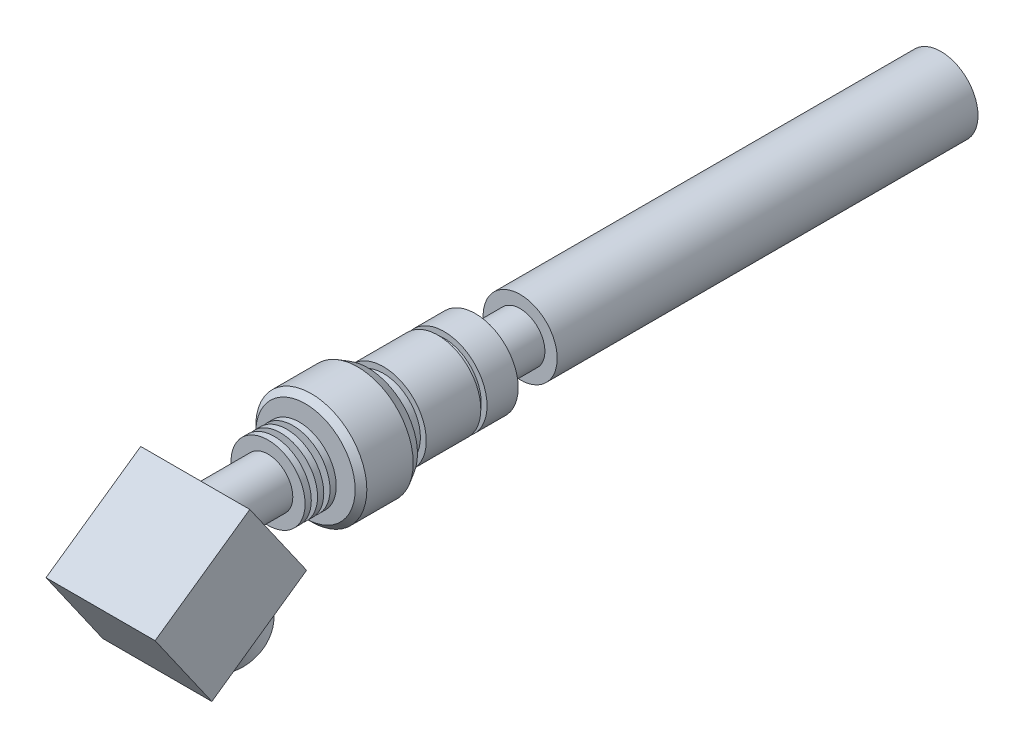
ISO-10303-21;
HEADER;
FILE_DESCRIPTION(('STEP AP214'),'2;1');
FILE_NAME('part.step','',(''),(''),'','','');
FILE_SCHEMA(('AUTOMOTIVE_DESIGN { 1 0 10303 214 1 1 1 1 }'));
ENDSEC;
DATA;
#1=APPLICATION_CONTEXT('core data for automotive mechanical design processes');
#2=APPLICATION_PROTOCOL_DEFINITION('international standard','automotive_design',2000,#1);
#3=PRODUCT_CONTEXT('',#1,'mechanical');
#4=PRODUCT('Part','Part','',(#3));
#5=PRODUCT_RELATED_PRODUCT_CATEGORY('part','',(#4));
#6=PRODUCT_DEFINITION_FORMATION('','',#4);
#7=PRODUCT_DEFINITION_CONTEXT('part definition',#1,'design');
#8=PRODUCT_DEFINITION('design','',#6,#7);
#9=PRODUCT_DEFINITION_SHAPE('','',#8);
#10=(LENGTH_UNIT() NAMED_UNIT(*) SI_UNIT(.MILLI.,.METRE.));
#11=(NAMED_UNIT(*) PLANE_ANGLE_UNIT() SI_UNIT($,.RADIAN.));
#12=(NAMED_UNIT(*) SI_UNIT($,.STERADIAN.) SOLID_ANGLE_UNIT());
#13=UNCERTAINTY_MEASURE_WITH_UNIT(LENGTH_MEASURE(1.E-05),#10,'distance_accuracy_value','');
#14=(GEOMETRIC_REPRESENTATION_CONTEXT(3) GLOBAL_UNCERTAINTY_ASSIGNED_CONTEXT((#13)) GLOBAL_UNIT_ASSIGNED_CONTEXT((#10,
#11,#12)) REPRESENTATION_CONTEXT('',''));
#15=CARTESIAN_POINT('',(0.,0.,0.));
#16=DIRECTION('',(0.,0.,1.));
#17=DIRECTION('',(1.,0.,0.));
#18=AXIS2_PLACEMENT_3D('',#15,#16,#17);
#19=CARTESIAN_POINT('',(-14.,-27.420874769388,201.119293340639));
#20=DIRECTION('',(0.,-0.819152044288995,-0.573576436351042));
#21=DIRECTION('',(0.,0.573576436351042,-0.819152044288995));
#22=AXIS2_PLACEMENT_3D('',#19,#20,#21);
#23=PLANE('',#22);
#24=DIRECTION('',(1.,0.,0.));
#25=VECTOR('',#24,1.);
#26=CARTESIAN_POINT('',(-14.,-10.4032309624702,176.815579258342));
#27=LINE('',#26,#25);
#28=CARTESIAN_POINT('',(-14.,-10.4032309624702,176.815579258342));
#29=VERTEX_POINT('',#28);
#30=CARTESIAN_POINT('',(14.,-10.4032309624702,176.815579258342));
#31=VERTEX_POINT('',#30);
#32=EDGE_CURVE('E75',#29,#31,#27,.T.);
#33=ORIENTED_EDGE('',*,*,#32,.T.);
#34=DIRECTION('',(0.,0.573576436351042,-0.819152044288995));
#35=VECTOR('',#34,1.);
#36=CARTESIAN_POINT('',(14.,-27.420874769388,201.119293340639));
#37=LINE('',#36,#35);
#38=CARTESIAN_POINT('',(14.,-27.420874769388,201.119293340639));
#39=VERTEX_POINT('',#38);
#40=EDGE_CURVE('E79',#39,#31,#37,.T.);
#41=ORIENTED_EDGE('',*,*,#40,.F.);
#42=DIRECTION('',(1.,0.,0.));
#43=VECTOR('',#42,1.);
#44=CARTESIAN_POINT('',(-14.,-27.420874769388,201.119293340639));
#45=LINE('',#44,#43);
#46=CARTESIAN_POINT('',(-14.,-27.420874769388,201.119293340639));
#47=VERTEX_POINT('',#46);
#48=EDGE_CURVE('E50',#47,#39,#45,.T.);
#49=ORIENTED_EDGE('',*,*,#48,.F.);
#50=DIRECTION('',(0.,0.573576436351042,-0.819152044288995));
#51=VECTOR('',#50,1.);
#52=CARTESIAN_POINT('',(-14.,-27.420874769388,201.119293340639));
#53=LINE('',#52,#51);
#54=EDGE_CURVE('E80',#47,#29,#53,.T.);
#55=ORIENTED_EDGE('',*,*,#54,.T.);
#56=EDGE_LOOP('',(#33,#41,#49,#55));
#57=FACE_BOUND('',#56,.T.);
#58=CARTESIAN_POINT('',(0.,-18.9120528659291,188.967436299491));
#59=DIRECTION('',(0.,-0.819152044288995,-0.573576436351042));
#60=DIRECTION('',(0.,0.573576436351042,-0.819152044288995));
#61=AXIS2_PLACEMENT_3D('',#58,#59,#60);
#62=CIRCLE('',#61,8.);
#63=CARTESIAN_POINT('',(0.,-14.3234413751208,182.414219945179));
#64=VERTEX_POINT('',#63);
#65=EDGE_CURVE('E102',#64,#64,#62,.T.);
#66=ORIENTED_EDGE('',*,*,#65,.F.);
#67=EDGE_LOOP('',(#66));
#68=FACE_BOUND('',#67,.T.);
#69=ADVANCED_FACE('F35',(#57,#68),#23,.T.);
#70=CARTESIAN_POINT('',(0.,0.,163.1));
#71=DIRECTION('',(0.,0.,1.));
#72=DIRECTION('',(1.,0.,0.));
#73=AXIS2_PLACEMENT_3D('',#70,#71,#72);
#74=PLANE('',#73);
#75=CARTESIAN_POINT('',(0.,0.,163.1));
#76=DIRECTION('',(0.,0.,1.));
#77=DIRECTION('',(1.,0.,0.));
#78=AXIS2_PLACEMENT_3D('',#75,#76,#77);
#79=CIRCLE('',#78,12.75);
#80=CARTESIAN_POINT('',(12.75,0.,163.1));
#81=VERTEX_POINT('',#80);
#82=EDGE_CURVE('E193',#81,#81,#79,.T.);
#83=ORIENTED_EDGE('',*,*,#82,.T.);
#84=EDGE_LOOP('',(#83));
#85=FACE_BOUND('',#84,.T.);
#86=CARTESIAN_POINT('',(0.,0.,163.1));
#87=DIRECTION('',(0.,0.,1.));
#88=DIRECTION('',(1.,0.,0.));
#89=AXIS2_PLACEMENT_3D('',#86,#87,#88);
#90=CIRCLE('',#89,6.35);
#91=CARTESIAN_POINT('',(6.35,0.,163.1));
#92=VERTEX_POINT('',#91);
#93=EDGE_CURVE('E156',#92,#92,#90,.T.);
#94=ORIENTED_EDGE('',*,*,#93,.F.);
#95=EDGE_LOOP('',(#94));
#96=FACE_BOUND('',#95,.T.);
#97=ADVANCED_FACE('F217',(#85,#96),#74,.T.);
#98=CARTESIAN_POINT('',(0.,0.,143.1));
#99=DIRECTION('',(0.,0.,1.));
#100=DIRECTION('',(1.,0.,0.));
#101=AXIS2_PLACEMENT_3D('',#98,#99,#100);
#102=PLANE('',#101);
#103=CARTESIAN_POINT('',(0.,0.,143.1));
#104=DIRECTION('',(0.,0.,1.));
#105=DIRECTION('',(1.,0.,0.));
#106=AXIS2_PLACEMENT_3D('',#103,#104,#105);
#107=CIRCLE('',#106,11.);
#108=CARTESIAN_POINT('',(11.,0.,143.1));
#109=VERTEX_POINT('',#108);
#110=EDGE_CURVE('E166',#109,#109,#107,.T.);
#111=ORIENTED_EDGE('',*,*,#110,.T.);
#112=EDGE_LOOP('',(#111));
#113=FACE_BOUND('',#112,.T.);
#114=CARTESIAN_POINT('',(0.,0.,143.1));
#115=DIRECTION('',(0.,0.,1.));
#116=DIRECTION('',(1.,0.,0.));
#117=AXIS2_PLACEMENT_3D('',#114,#115,#116);
#118=CIRCLE('',#117,9.5);
#119=CARTESIAN_POINT('',(9.5,0.,143.1));
#120=VERTEX_POINT('',#119);
#121=EDGE_CURVE('E159',#120,#120,#118,.T.);
#122=ORIENTED_EDGE('',*,*,#121,.F.);
#123=EDGE_LOOP('',(#122));
#124=FACE_BOUND('',#123,.T.);
#125=ADVANCED_FACE('F222',(#113,#124),#102,.T.);
#126=CARTESIAN_POINT('',(0.,0.,127.5));
#127=DIRECTION('',(0.,0.,1.));
#128=DIRECTION('',(1.,0.,0.));
#129=AXIS2_PLACEMENT_3D('',#126,#127,#128);
#130=PLANE('',#129);
#131=CARTESIAN_POINT('',(0.,0.,127.5));
#132=DIRECTION('',(0.,0.,1.));
#133=DIRECTION('',(1.,0.,0.));
#134=AXIS2_PLACEMENT_3D('',#131,#132,#133);
#135=CIRCLE('',#134,11.);
#136=CARTESIAN_POINT('',(11.,0.,127.5));
#137=VERTEX_POINT('',#136);
#138=EDGE_CURVE('E178',#137,#137,#135,.T.);
#139=ORIENTED_EDGE('',*,*,#138,.T.);
#140=EDGE_LOOP('',(#139));
#141=FACE_BOUND('',#140,.T.);
#142=CARTESIAN_POINT('',(0.,0.,127.5));
#143=DIRECTION('',(0.,0.,1.));
#144=DIRECTION('',(1.,0.,0.));
#145=AXIS2_PLACEMENT_3D('',#142,#143,#144);
#146=CIRCLE('',#145,9.5);
#147=CARTESIAN_POINT('',(9.5,0.,127.5));
#148=VERTEX_POINT('',#147);
#149=EDGE_CURVE('E169',#148,#148,#146,.T.);
#150=ORIENTED_EDGE('',*,*,#149,.F.);
#151=EDGE_LOOP('',(#150));
#152=FACE_BOUND('',#151,.T.);
#153=ADVANCED_FACE('F294',(#141,#152),#130,.T.);
#154=CARTESIAN_POINT('',(0.,0.,108.));
#155=DIRECTION('',(0.,0.,1.));
#156=DIRECTION('',(1.,0.,0.));
#157=AXIS2_PLACEMENT_3D('',#154,#155,#156);
#158=PLANE('',#157);
#159=CARTESIAN_POINT('',(0.,0.,108.));
#160=DIRECTION('',(0.,0.,1.));
#161=DIRECTION('',(1.,0.,0.));
#162=AXIS2_PLACEMENT_3D('',#159,#160,#161);
#163=CIRCLE('',#162,9.5);
#164=CARTESIAN_POINT('',(9.5,0.,108.));
#165=VERTEX_POINT('',#164);
#166=EDGE_CURVE('E190',#165,#165,#163,.T.);
#167=ORIENTED_EDGE('',*,*,#166,.T.);
#168=EDGE_LOOP('',(#167));
#169=FACE_BOUND('',#168,.T.);
#170=CARTESIAN_POINT('',(0.,0.,108.));
#171=DIRECTION('',(0.,0.,1.));
#172=DIRECTION('',(1.,0.,0.));
#173=AXIS2_PLACEMENT_3D('',#170,#171,#172);
#174=CIRCLE('',#173,6.35);
#175=CARTESIAN_POINT('',(6.35,0.,108.));
#176=VERTEX_POINT('',#175);
#177=EDGE_CURVE('E181',#176,#176,#174,.T.);
#178=ORIENTED_EDGE('',*,*,#177,.F.);
#179=EDGE_LOOP('',(#178));
#180=FACE_BOUND('',#179,.T.);
#181=ADVANCED_FACE('F310',(#169,#180),#158,.T.);
#182=CARTESIAN_POINT('',(0.,0.,108.));
#183=DIRECTION('',(0.,0.,-1.));
#184=DIRECTION('',(-1.,0.,0.));
#185=AXIS2_PLACEMENT_3D('',#182,#183,#184);
#186=CYLINDRICAL_SURFACE('',#185,9.5);
#187=ORIENTED_EDGE('',*,*,#166,.F.);
#188=EDGE_LOOP('',(#187));
#189=FACE_BOUND('',#188,.T.);
#190=CARTESIAN_POINT('',(0.,0.,0.));
#191=DIRECTION('',(0.,0.,1.));
#192=DIRECTION('',(1.,0.,0.));
#193=AXIS2_PLACEMENT_3D('',#190,#191,#192);
#194=CIRCLE('',#193,9.5);
#195=CARTESIAN_POINT('',(9.5,0.,0.));
#196=VERTEX_POINT('',#195);
#197=EDGE_CURVE('E187',#196,#196,#194,.T.);
#198=ORIENTED_EDGE('',*,*,#197,.T.);
#199=EDGE_LOOP('',(#198));
#200=FACE_BOUND('',#199,.T.);
#201=ADVANCED_FACE('F326',(#189,#200),#186,.T.);
#202=CARTESIAN_POINT('',(0.,0.,0.));
#203=DIRECTION('',(0.,0.,1.));
#204=DIRECTION('',(1.,0.,0.));
#205=AXIS2_PLACEMENT_3D('',#202,#203,#204);
#206=PLANE('',#205);
#207=ORIENTED_EDGE('',*,*,#197,.F.);
#208=EDGE_LOOP('',(#207));
#209=FACE_BOUND('',#208,.T.);
#210=ADVANCED_FACE('F322',(#209),#206,.F.);
#211=CARTESIAN_POINT('',(0.,0.,119.5));
#212=DIRECTION('',(0.,0.,-1.));
#213=DIRECTION('',(-1.,0.,0.));
#214=AXIS2_PLACEMENT_3D('',#211,#212,#213);
#215=CYLINDRICAL_SURFACE('',#214,6.35);
#216=CARTESIAN_POINT('',(0.,0.,119.5));
#217=DIRECTION('',(0.,0.,1.));
#218=DIRECTION('',(1.,0.,0.));
#219=AXIS2_PLACEMENT_3D('',#216,#217,#218);
#220=CIRCLE('',#219,6.35);
#221=CARTESIAN_POINT('',(6.35,0.,119.5));
#222=VERTEX_POINT('',#221);
#223=EDGE_CURVE('E184',#222,#222,#220,.T.);
#224=ORIENTED_EDGE('',*,*,#223,.F.);
#225=EDGE_LOOP('',(#224));
#226=FACE_BOUND('',#225,.T.);
#227=ORIENTED_EDGE('',*,*,#177,.T.);
#228=EDGE_LOOP('',(#227));
#229=FACE_BOUND('',#228,.T.);
#230=ADVANCED_FACE('F315',(#226,#229),#215,.T.);
#231=CARTESIAN_POINT('',(0.,0.,119.5));
#232=DIRECTION('',(0.,0.,1.));
#233=DIRECTION('',(1.,0.,0.));
#234=AXIS2_PLACEMENT_3D('',#231,#232,#233);
#235=PLANE('',#234);
#236=CARTESIAN_POINT('',(0.,0.,119.5));
#237=DIRECTION('',(0.,0.,1.));
#238=DIRECTION('',(1.,0.,0.));
#239=AXIS2_PLACEMENT_3D('',#236,#237,#238);
#240=CIRCLE('',#239,11.);
#241=CARTESIAN_POINT('',(11.,0.,119.5));
#242=VERTEX_POINT('',#241);
#243=EDGE_CURVE('E175',#242,#242,#240,.T.);
#244=ORIENTED_EDGE('',*,*,#243,.F.);
#245=EDGE_LOOP('',(#244));
#246=FACE_BOUND('',#245,.T.);
#247=ORIENTED_EDGE('',*,*,#223,.T.);
#248=EDGE_LOOP('',(#247));
#249=FACE_BOUND('',#248,.T.);
#250=ADVANCED_FACE('F312',(#246,#249),#235,.F.);
#251=CARTESIAN_POINT('',(0.,0.,127.5));
#252=DIRECTION('',(0.,0.,-1.));
#253=DIRECTION('',(-1.,0.,0.));
#254=AXIS2_PLACEMENT_3D('',#251,#252,#253);
#255=CYLINDRICAL_SURFACE('',#254,11.);
#256=ORIENTED_EDGE('',*,*,#138,.F.);
#257=EDGE_LOOP('',(#256));
#258=FACE_BOUND('',#257,.T.);
#259=ORIENTED_EDGE('',*,*,#243,.T.);
#260=EDGE_LOOP('',(#259));
#261=FACE_BOUND('',#260,.T.);
#262=ADVANCED_FACE('F306',(#258,#261),#255,.T.);
#263=CARTESIAN_POINT('',(0.,0.,129.1));
#264=DIRECTION('',(0.,0.,-1.));
#265=DIRECTION('',(-1.,0.,0.));
#266=AXIS2_PLACEMENT_3D('',#263,#264,#265);
#267=CYLINDRICAL_SURFACE('',#266,9.5);
#268=CARTESIAN_POINT('',(0.,0.,129.1));
#269=DIRECTION('',(0.,0.,1.));
#270=DIRECTION('',(1.,0.,0.));
#271=AXIS2_PLACEMENT_3D('',#268,#269,#270);
#272=CIRCLE('',#271,9.5);
#273=CARTESIAN_POINT('',(9.5,0.,129.1));
#274=VERTEX_POINT('',#273);
#275=EDGE_CURVE('E172',#274,#274,#272,.T.);
#276=ORIENTED_EDGE('',*,*,#275,.F.);
#277=EDGE_LOOP('',(#276));
#278=FACE_BOUND('',#277,.T.);
#279=ORIENTED_EDGE('',*,*,#149,.T.);
#280=EDGE_LOOP('',(#279));
#281=FACE_BOUND('',#280,.T.);
#282=ADVANCED_FACE('F299',(#278,#281),#267,.T.);
#283=CARTESIAN_POINT('',(0.,0.,129.1));
#284=DIRECTION('',(0.,0.,1.));
#285=DIRECTION('',(1.,0.,0.));
#286=AXIS2_PLACEMENT_3D('',#283,#284,#285);
#287=PLANE('',#286);
#288=CARTESIAN_POINT('',(0.,0.,129.1));
#289=DIRECTION('',(0.,0.,1.));
#290=DIRECTION('',(1.,0.,0.));
#291=AXIS2_PLACEMENT_3D('',#288,#289,#290);
#292=CIRCLE('',#291,11.);
#293=CARTESIAN_POINT('',(11.,0.,129.1));
#294=VERTEX_POINT('',#293);
#295=EDGE_CURVE('E163',#294,#294,#292,.T.);
#296=ORIENTED_EDGE('',*,*,#295,.F.);
#297=EDGE_LOOP('',(#296));
#298=FACE_BOUND('',#297,.T.);
#299=ORIENTED_EDGE('',*,*,#275,.T.);
#300=EDGE_LOOP('',(#299));
#301=FACE_BOUND('',#300,.T.);
#302=ADVANCED_FACE('F296',(#298,#301),#287,.F.);
#303=CARTESIAN_POINT('',(0.,0.,143.1));
#304=DIRECTION('',(0.,0.,-1.));
#305=DIRECTION('',(-1.,0.,0.));
#306=AXIS2_PLACEMENT_3D('',#303,#304,#305);
#307=CYLINDRICAL_SURFACE('',#306,11.);
#308=ORIENTED_EDGE('',*,*,#110,.F.);
#309=EDGE_LOOP('',(#308));
#310=FACE_BOUND('',#309,.T.);
#311=ORIENTED_EDGE('',*,*,#295,.T.);
#312=EDGE_LOOP('',(#311));
#313=FACE_BOUND('',#312,.T.);
#314=ADVANCED_FACE('F290',(#310,#313),#307,.T.);
#315=CARTESIAN_POINT('',(0.,0.,147.1));
#316=DIRECTION('',(0.,0.,-1.));
#317=DIRECTION('',(-1.,0.,0.));
#318=AXIS2_PLACEMENT_3D('',#315,#316,#317);
#319=CYLINDRICAL_SURFACE('',#318,9.5);
#320=CARTESIAN_POINT('',(0.,0.,147.1));
#321=DIRECTION('',(0.,0.,1.));
#322=DIRECTION('',(1.,0.,0.));
#323=AXIS2_PLACEMENT_3D('',#320,#321,#322);
#324=CIRCLE('',#323,9.5);
#325=CARTESIAN_POINT('',(9.5,0.,147.1));
#326=VERTEX_POINT('',#325);
#327=EDGE_CURVE('E160',#326,#326,#324,.T.);
#328=ORIENTED_EDGE('',*,*,#327,.F.);
#329=EDGE_LOOP('',(#328));
#330=FACE_BOUND('',#329,.T.);
#331=ORIENTED_EDGE('',*,*,#121,.T.);
#332=EDGE_LOOP('',(#331));
#333=FACE_BOUND('',#332,.T.);
#334=ADVANCED_FACE('F284',(#330,#333),#319,.T.);
#335=CARTESIAN_POINT('',(0.,0.,147.1));
#336=DIRECTION('',(0.,0.,1.));
#337=DIRECTION('',(1.,0.,0.));
#338=AXIS2_PLACEMENT_3D('',#335,#336,#337);
#339=PLANE('',#338);
#340=CARTESIAN_POINT('',(0.,0.,147.1));
#341=DIRECTION('',(0.,0.,1.));
#342=DIRECTION('',(1.,0.,0.));
#343=AXIS2_PLACEMENT_3D('',#340,#341,#342);
#344=CIRCLE('',#343,12.75);
#345=CARTESIAN_POINT('',(12.75,0.,147.1));
#346=VERTEX_POINT('',#345);
#347=EDGE_CURVE('E11',#346,#346,#344,.F.);
#348=ORIENTED_EDGE('',*,*,#347,.T.);
#349=EDGE_LOOP('',(#348));
#350=FACE_BOUND('',#349,.T.);
#351=ORIENTED_EDGE('',*,*,#327,.T.);
#352=EDGE_LOOP('',(#351));
#353=FACE_BOUND('',#352,.T.);
#354=ADVANCED_FACE('F281',(#350,#353),#339,.F.);
#355=CARTESIAN_POINT('',(0.,0.,163.1));
#356=DIRECTION('',(0.,0.,-1.));
#357=DIRECTION('',(-1.,0.,0.));
#358=AXIS2_PLACEMENT_3D('',#355,#356,#357);
#359=CYLINDRICAL_SURFACE('',#358,14.25);
#360=CARTESIAN_POINT('',(0.,0.,149.698076211353));
#361=DIRECTION('',(0.,0.,1.));
#362=DIRECTION('',(1.,0.,0.));
#363=AXIS2_PLACEMENT_3D('',#360,#361,#362);
#364=CIRCLE('',#363,14.25);
#365=CARTESIAN_POINT('',(14.25,0.,149.698076211353));
#366=VERTEX_POINT('',#365);
#367=EDGE_CURVE('E43',#366,#366,#364,.T.);
#368=ORIENTED_EDGE('',*,*,#367,.T.);
#369=EDGE_LOOP('',(#368));
#370=FACE_BOUND('',#369,.T.);
#371=CARTESIAN_POINT('',(0.,0.,161.6));
#372=DIRECTION('',(0.,0.,1.));
#373=DIRECTION('',(1.,0.,0.));
#374=AXIS2_PLACEMENT_3D('',#371,#372,#373);
#375=CIRCLE('',#374,14.25);
#376=CARTESIAN_POINT('',(14.25,0.,161.6));
#377=VERTEX_POINT('',#376);
#378=EDGE_CURVE('E198',#377,#377,#375,.F.);
#379=ORIENTED_EDGE('',*,*,#378,.T.);
#380=EDGE_LOOP('',(#379));
#381=FACE_BOUND('',#380,.T.);
#382=ADVANCED_FACE('F203',(#370,#381),#359,.T.);
#383=CARTESIAN_POINT('',(0.,0.,163.1));
#384=DIRECTION('',(0.,0.,-1.));
#385=DIRECTION('',(-1.,0.,0.));
#386=AXIS2_PLACEMENT_3D('',#383,#384,#385);
#387=CONICAL_SURFACE('',#386,12.75,0.785398163397453);
#388=ORIENTED_EDGE('',*,*,#378,.F.);
#389=EDGE_LOOP('',(#388));
#390=FACE_BOUND('',#389,.T.);
#391=ORIENTED_EDGE('',*,*,#82,.F.);
#392=EDGE_LOOP('',(#391));
#393=FACE_BOUND('',#392,.T.);
#394=ADVANCED_FACE('F278',(#390,#393),#387,.T.);
#395=CARTESIAN_POINT('',(0.,0.,193.1));
#396=DIRECTION('',(0.,0.,1.));
#397=DIRECTION('',(1.,0.,0.));
#398=AXIS2_PLACEMENT_3D('',#395,#396,#397);
#399=CYLINDRICAL_SURFACE('',#398,6.35);
#400=CARTESIAN_POINT('',(0.,0.,164.7));
#401=DIRECTION('',(0.,0.,1.));
#402=DIRECTION('',(1.,0.,0.));
#403=AXIS2_PLACEMENT_3D('',#400,#401,#402);
#404=CIRCLE('',#403,6.35);
#405=CARTESIAN_POINT('',(6.35,0.,164.7));
#406=VERTEX_POINT('',#405);
#407=EDGE_CURVE('E153',#406,#406,#404,.T.);
#408=ORIENTED_EDGE('',*,*,#407,.F.);
#409=EDGE_LOOP('',(#408));
#410=FACE_BOUND('',#409,.T.);
#411=ORIENTED_EDGE('',*,*,#93,.T.);
#412=EDGE_LOOP('',(#411));
#413=FACE_BOUND('',#412,.T.);
#414=ADVANCED_FACE('F275',(#410,#413),#399,.T.);
#415=CARTESIAN_POINT('',(0.,6.35,164.7));
#416=DIRECTION('',(0.,0.,1.));
#417=DIRECTION('',(1.,0.,0.));
#418=AXIS2_PLACEMENT_3D('',#415,#416,#417);
#419=PLANE('',#418);
#420=CARTESIAN_POINT('',(0.,0.,164.7));
#421=DIRECTION('',(0.,0.,1.));
#422=DIRECTION('',(1.,0.,0.));
#423=AXIS2_PLACEMENT_3D('',#420,#421,#422);
#424=CIRCLE('',#423,9.50000000000001);
#425=CARTESIAN_POINT('',(9.50000000000001,0.,164.7));
#426=VERTEX_POINT('',#425);
#427=EDGE_CURVE('E150',#426,#426,#424,.T.);
#428=ORIENTED_EDGE('',*,*,#427,.F.);
#429=EDGE_LOOP('',(#428));
#430=FACE_BOUND('',#429,.T.);
#431=ORIENTED_EDGE('',*,*,#407,.T.);
#432=EDGE_LOOP('',(#431));
#433=FACE_BOUND('',#432,.T.);
#434=ADVANCED_FACE('F271',(#430,#433),#419,.F.);
#435=CARTESIAN_POINT('',(0.,0.,193.1));
#436=DIRECTION('',(0.,0.,1.));
#437=DIRECTION('',(1.,0.,0.));
#438=AXIS2_PLACEMENT_3D('',#435,#436,#437);
#439=CYLINDRICAL_SURFACE('',#438,9.50000000000001);
#440=CARTESIAN_POINT('',(0.,0.,166.3));
#441=DIRECTION('',(0.,0.,1.));
#442=DIRECTION('',(1.,0.,0.));
#443=AXIS2_PLACEMENT_3D('',#440,#441,#442);
#444=CIRCLE('',#443,9.5);
#445=CARTESIAN_POINT('',(9.5,0.,166.3));
#446=VERTEX_POINT('',#445);
#447=EDGE_CURVE('E147',#446,#446,#444,.T.);
#448=ORIENTED_EDGE('',*,*,#447,.F.);
#449=EDGE_LOOP('',(#448));
#450=FACE_BOUND('',#449,.T.);
#451=ORIENTED_EDGE('',*,*,#427,.T.);
#452=EDGE_LOOP('',(#451));
#453=FACE_BOUND('',#452,.T.);
#454=ADVANCED_FACE('F267',(#450,#453),#439,.T.);
#455=CARTESIAN_POINT('',(0.,9.5,166.3));
#456=DIRECTION('',(0.,0.,-1.));
#457=DIRECTION('',(-1.,0.,0.));
#458=AXIS2_PLACEMENT_3D('',#455,#456,#457);
#459=PLANE('',#458);
#460=CARTESIAN_POINT('',(0.,0.,166.3));
#461=DIRECTION('',(0.,0.,1.));
#462=DIRECTION('',(1.,0.,0.));
#463=AXIS2_PLACEMENT_3D('',#460,#461,#462);
#464=CIRCLE('',#463,6.35);
#465=CARTESIAN_POINT('',(6.35,0.,166.3));
#466=VERTEX_POINT('',#465);
#467=EDGE_CURVE('E144',#466,#466,#464,.T.);
#468=ORIENTED_EDGE('',*,*,#467,.F.);
#469=EDGE_LOOP('',(#468));
#470=FACE_BOUND('',#469,.T.);
#471=ORIENTED_EDGE('',*,*,#447,.T.);
#472=EDGE_LOOP('',(#471));
#473=FACE_BOUND('',#472,.T.);
#474=ADVANCED_FACE('F263',(#470,#473),#459,.F.);
#475=CARTESIAN_POINT('',(0.,0.,193.1));
#476=DIRECTION('',(0.,0.,1.));
#477=DIRECTION('',(1.,0.,0.));
#478=AXIS2_PLACEMENT_3D('',#475,#476,#477);
#479=CYLINDRICAL_SURFACE('',#478,6.35);
#480=CARTESIAN_POINT('',(0.,0.,167.9));
#481=DIRECTION('',(0.,0.,1.));
#482=DIRECTION('',(1.,0.,0.));
#483=AXIS2_PLACEMENT_3D('',#480,#481,#482);
#484=CIRCLE('',#483,6.35);
#485=CARTESIAN_POINT('',(6.35,0.,167.9));
#486=VERTEX_POINT('',#485);
#487=EDGE_CURVE('E141',#486,#486,#484,.T.);
#488=ORIENTED_EDGE('',*,*,#487,.F.);
#489=EDGE_LOOP('',(#488));
#490=FACE_BOUND('',#489,.T.);
#491=ORIENTED_EDGE('',*,*,#467,.T.);
#492=EDGE_LOOP('',(#491));
#493=FACE_BOUND('',#492,.T.);
#494=ADVANCED_FACE('F259',(#490,#493),#479,.T.);
#495=CARTESIAN_POINT('',(0.,6.35,167.9));
#496=DIRECTION('',(0.,0.,1.));
#497=DIRECTION('',(1.,0.,0.));
#498=AXIS2_PLACEMENT_3D('',#495,#496,#497);
#499=PLANE('',#498);
#500=CARTESIAN_POINT('',(0.,0.,167.9));
#501=DIRECTION('',(0.,0.,1.));
#502=DIRECTION('',(1.,0.,0.));
#503=AXIS2_PLACEMENT_3D('',#500,#501,#502);
#504=CIRCLE('',#503,9.5);
#505=CARTESIAN_POINT('',(9.5,0.,167.9));
#506=VERTEX_POINT('',#505);
#507=EDGE_CURVE('E138',#506,#506,#504,.T.);
#508=ORIENTED_EDGE('',*,*,#507,.F.);
#509=EDGE_LOOP('',(#508));
#510=FACE_BOUND('',#509,.T.);
#511=ORIENTED_EDGE('',*,*,#487,.T.);
#512=EDGE_LOOP('',(#511));
#513=FACE_BOUND('',#512,.T.);
#514=ADVANCED_FACE('F255',(#510,#513),#499,.F.);
#515=CARTESIAN_POINT('',(0.,0.,193.1));
#516=DIRECTION('',(0.,0.,1.));
#517=DIRECTION('',(1.,0.,0.));
#518=AXIS2_PLACEMENT_3D('',#515,#516,#517);
#519=CYLINDRICAL_SURFACE('',#518,9.5);
#520=CARTESIAN_POINT('',(0.,0.,169.5));
#521=DIRECTION('',(0.,0.,1.));
#522=DIRECTION('',(1.,0.,0.));
#523=AXIS2_PLACEMENT_3D('',#520,#521,#522);
#524=CIRCLE('',#523,9.5);
#525=CARTESIAN_POINT('',(9.5,0.,169.5));
#526=VERTEX_POINT('',#525);
#527=EDGE_CURVE('E135',#526,#526,#524,.T.);
#528=ORIENTED_EDGE('',*,*,#527,.F.);
#529=EDGE_LOOP('',(#528));
#530=FACE_BOUND('',#529,.T.);
#531=ORIENTED_EDGE('',*,*,#507,.T.);
#532=EDGE_LOOP('',(#531));
#533=FACE_BOUND('',#532,.T.);
#534=ADVANCED_FACE('F251',(#530,#533),#519,.T.);
#535=CARTESIAN_POINT('',(0.,9.5,169.5));
#536=DIRECTION('',(0.,0.,-1.));
#537=DIRECTION('',(-1.,0.,0.));
#538=AXIS2_PLACEMENT_3D('',#535,#536,#537);
#539=PLANE('',#538);
#540=CARTESIAN_POINT('',(0.,0.,169.5));
#541=DIRECTION('',(0.,0.,1.));
#542=DIRECTION('',(1.,0.,0.));
#543=AXIS2_PLACEMENT_3D('',#540,#541,#542);
#544=CIRCLE('',#543,6.35);
#545=CARTESIAN_POINT('',(6.35,0.,169.5));
#546=VERTEX_POINT('',#545);
#547=EDGE_CURVE('E132',#546,#546,#544,.T.);
#548=ORIENTED_EDGE('',*,*,#547,.F.);
#549=EDGE_LOOP('',(#548));
#550=FACE_BOUND('',#549,.T.);
#551=ORIENTED_EDGE('',*,*,#527,.T.);
#552=EDGE_LOOP('',(#551));
#553=FACE_BOUND('',#552,.T.);
#554=ADVANCED_FACE('F247',(#550,#553),#539,.F.);
#555=CARTESIAN_POINT('',(0.,0.,193.1));
#556=DIRECTION('',(0.,0.,1.));
#557=DIRECTION('',(1.,0.,0.));
#558=AXIS2_PLACEMENT_3D('',#555,#556,#557);
#559=CYLINDRICAL_SURFACE('',#558,6.35);
#560=CARTESIAN_POINT('',(0.,0.,171.1));
#561=DIRECTION('',(0.,0.,1.));
#562=DIRECTION('',(1.,0.,0.));
#563=AXIS2_PLACEMENT_3D('',#560,#561,#562);
#564=CIRCLE('',#563,6.35);
#565=CARTESIAN_POINT('',(6.35,0.,171.1));
#566=VERTEX_POINT('',#565);
#567=EDGE_CURVE('E129',#566,#566,#564,.T.);
#568=ORIENTED_EDGE('',*,*,#567,.F.);
#569=EDGE_LOOP('',(#568));
#570=FACE_BOUND('',#569,.T.);
#571=ORIENTED_EDGE('',*,*,#547,.T.);
#572=EDGE_LOOP('',(#571));
#573=FACE_BOUND('',#572,.T.);
#574=ADVANCED_FACE('F243',(#570,#573),#559,.T.);
#575=CARTESIAN_POINT('',(0.,6.35,171.1));
#576=DIRECTION('',(0.,0.,1.));
#577=DIRECTION('',(1.,0.,0.));
#578=AXIS2_PLACEMENT_3D('',#575,#576,#577);
#579=PLANE('',#578);
#580=CARTESIAN_POINT('',(0.,0.,171.1));
#581=DIRECTION('',(0.,0.,1.));
#582=DIRECTION('',(1.,0.,0.));
#583=AXIS2_PLACEMENT_3D('',#580,#581,#582);
#584=CIRCLE('',#583,9.5);
#585=CARTESIAN_POINT('',(9.5,0.,171.1));
#586=VERTEX_POINT('',#585);
#587=EDGE_CURVE('E126',#586,#586,#584,.T.);
#588=ORIENTED_EDGE('',*,*,#587,.F.);
#589=EDGE_LOOP('',(#588));
#590=FACE_BOUND('',#589,.T.);
#591=ORIENTED_EDGE('',*,*,#567,.T.);
#592=EDGE_LOOP('',(#591));
#593=FACE_BOUND('',#592,.T.);
#594=ADVANCED_FACE('F239',(#590,#593),#579,.F.);
#595=CARTESIAN_POINT('',(0.,0.,193.1));
#596=DIRECTION('',(0.,0.,1.));
#597=DIRECTION('',(1.,0.,0.));
#598=AXIS2_PLACEMENT_3D('',#595,#596,#597);
#599=CYLINDRICAL_SURFACE('',#598,9.5);
#600=CARTESIAN_POINT('',(0.,0.,172.7));
#601=DIRECTION('',(0.,0.,1.));
#602=DIRECTION('',(1.,0.,0.));
#603=AXIS2_PLACEMENT_3D('',#600,#601,#602);
#604=CIRCLE('',#603,9.5);
#605=CARTESIAN_POINT('',(9.5,0.,172.7));
#606=VERTEX_POINT('',#605);
#607=EDGE_CURVE('E123',#606,#606,#604,.T.);
#608=ORIENTED_EDGE('',*,*,#607,.F.);
#609=EDGE_LOOP('',(#608));
#610=FACE_BOUND('',#609,.T.);
#611=ORIENTED_EDGE('',*,*,#587,.T.);
#612=EDGE_LOOP('',(#611));
#613=FACE_BOUND('',#612,.T.);
#614=ADVANCED_FACE('F235',(#610,#613),#599,.T.);
#615=CARTESIAN_POINT('',(0.,9.5,172.7));
#616=DIRECTION('',(0.,0.,-1.));
#617=DIRECTION('',(-1.,0.,0.));
#618=AXIS2_PLACEMENT_3D('',#615,#616,#617);
#619=PLANE('',#618);
#620=CARTESIAN_POINT('',(0.,0.,172.7));
#621=DIRECTION('',(0.,0.,1.));
#622=DIRECTION('',(1.,0.,0.));
#623=AXIS2_PLACEMENT_3D('',#620,#621,#622);
#624=CIRCLE('',#623,6.35);
#625=CARTESIAN_POINT('',(6.35,0.,172.7));
#626=VERTEX_POINT('',#625);
#627=EDGE_CURVE('E120',#626,#626,#624,.T.);
#628=ORIENTED_EDGE('',*,*,#627,.F.);
#629=EDGE_LOOP('',(#628));
#630=FACE_BOUND('',#629,.T.);
#631=ORIENTED_EDGE('',*,*,#607,.T.);
#632=EDGE_LOOP('',(#631));
#633=FACE_BOUND('',#632,.T.);
#634=ADVANCED_FACE('F231',(#630,#633),#619,.F.);
#635=CARTESIAN_POINT('',(0.,0.,193.1));
#636=DIRECTION('',(0.,0.,1.));
#637=DIRECTION('',(1.,0.,0.));
#638=AXIS2_PLACEMENT_3D('',#635,#636,#637);
#639=CYLINDRICAL_SURFACE('',#638,6.35);
#640=CARTESIAN_POINT('',(0.,0.,184.1));
#641=DIRECTION('',(0.,0.573576436351042,-0.819152044288995));
#642=DIRECTION('',(0.,0.819152044288995,0.573576436351042));
#643=AXIS2_PLACEMENT_3D('',#640,#641,#642);
#644=ELLIPSE('',#643,7.75191863863522,6.35);
#645=CARTESIAN_POINT('',(0.,6.35,188.546317867632));
#646=VERTEX_POINT('',#645);
#647=EDGE_CURVE('E115',#646,#646,#644,.T.);
#648=ORIENTED_EDGE('',*,*,#647,.T.);
#649=EDGE_LOOP('',(#648));
#650=FACE_BOUND('',#649,.T.);
#651=ORIENTED_EDGE('',*,*,#627,.T.);
#652=EDGE_LOOP('',(#651));
#653=FACE_BOUND('',#652,.T.);
#654=ADVANCED_FACE('F228',(#650,#653),#639,.T.);
#655=CARTESIAN_POINT('',(-14.,-10.4032309624702,176.815579258342));
#656=DIRECTION('',(0.,0.573576436351042,-0.819152044288995));
#657=DIRECTION('',(0.,0.819152044288995,0.573576436351042));
#658=AXIS2_PLACEMENT_3D('',#655,#656,#657);
#659=PLANE('',#658);
#660=DIRECTION('',(1.,0.,0.));
#661=VECTOR('',#660,1.);
#662=CARTESIAN_POINT('',(-14.,10.4032309624702,191.384420741658));
#663=LINE('',#662,#661);
#664=CARTESIAN_POINT('',(-14.,10.4032309624702,191.384420741658));
#665=VERTEX_POINT('',#664);
#666=CARTESIAN_POINT('',(14.,10.4032309624702,191.384420741658));
#667=VERTEX_POINT('',#666);
#668=EDGE_CURVE('E84',#665,#667,#663,.T.);
#669=ORIENTED_EDGE('',*,*,#668,.T.);
#670=DIRECTION('',(0.,0.819152044288995,0.573576436351042));
#671=VECTOR('',#670,1.);
#672=CARTESIAN_POINT('',(14.,-10.4032309624702,176.815579258342));
#673=LINE('',#672,#671);
#674=EDGE_CURVE('E88',#31,#667,#673,.T.);
#675=ORIENTED_EDGE('',*,*,#674,.F.);
#676=ORIENTED_EDGE('',*,*,#32,.F.);
#677=DIRECTION('',(0.,0.819152044288995,0.573576436351042));
#678=VECTOR('',#677,1.);
#679=CARTESIAN_POINT('',(-14.,-10.4032309624702,176.815579258342));
#680=LINE('',#679,#678);
#681=EDGE_CURVE('E109',#29,#665,#680,.T.);
#682=ORIENTED_EDGE('',*,*,#681,.T.);
#683=EDGE_LOOP('',(#669,#675,#676,#682));
#684=FACE_BOUND('',#683,.T.);
#685=ORIENTED_EDGE('',*,*,#647,.F.);
#686=EDGE_LOOP('',(#685));
#687=FACE_BOUND('',#686,.T.);
#688=ADVANCED_FACE('F89',(#684,#687),#659,.T.);
#689=CARTESIAN_POINT('',(-14.,-6.61441284444758,215.688134823956));
#690=DIRECTION('',(0.,-0.573576436351042,0.819152044288995));
#691=DIRECTION('',(0.,-0.819152044288995,-0.573576436351042));
#692=AXIS2_PLACEMENT_3D('',#689,#690,#691);
#693=PLANE('',#692);
#694=ORIENTED_EDGE('',*,*,#48,.T.);
#695=DIRECTION('',(0.,-0.819152044288995,-0.573576436351042));
#696=VECTOR('',#695,1.);
#697=CARTESIAN_POINT('',(14.,-6.61441284444758,215.688134823956));
#698=LINE('',#697,#696);
#699=CARTESIAN_POINT('',(14.,-6.61441284444758,215.688134823956));
#700=VERTEX_POINT('',#699);
#701=EDGE_CURVE('E98',#700,#39,#698,.T.);
#702=ORIENTED_EDGE('',*,*,#701,.F.);
#703=DIRECTION('',(1.,0.,0.));
#704=VECTOR('',#703,1.);
#705=CARTESIAN_POINT('',(-14.,-6.61441284444758,215.688134823956));
#706=LINE('',#705,#704);
#707=CARTESIAN_POINT('',(-14.,-6.61441284444758,215.688134823956));
#708=VERTEX_POINT('',#707);
#709=EDGE_CURVE('E58',#708,#700,#706,.T.);
#710=ORIENTED_EDGE('',*,*,#709,.F.);
#711=DIRECTION('',(0.,-0.819152044288995,-0.573576436351042));
#712=VECTOR('',#711,1.);
#713=CARTESIAN_POINT('',(-14.,-6.61441284444758,215.688134823956));
#714=LINE('',#713,#712);
#715=EDGE_CURVE('E85',#708,#47,#714,.T.);
#716=ORIENTED_EDGE('',*,*,#715,.T.);
#717=EDGE_LOOP('',(#694,#702,#710,#716));
#718=FACE_BOUND('',#717,.T.);
#719=ADVANCED_FACE('F405',(#718),#693,.T.);
#720=CARTESIAN_POINT('',(-14.,10.4032309624702,191.384420741658));
#721=DIRECTION('',(0.,0.819152044288995,0.573576436351042));
#722=DIRECTION('',(0.,-0.573576436351042,0.819152044288995));
#723=AXIS2_PLACEMENT_3D('',#720,#721,#722);
#724=PLANE('',#723);
#725=ORIENTED_EDGE('',*,*,#709,.T.);
#726=DIRECTION('',(0.,-0.573576436351042,0.819152044288995));
#727=VECTOR('',#726,1.);
#728=CARTESIAN_POINT('',(14.,10.4032309624702,191.384420741658));
#729=LINE('',#728,#727);
#730=EDGE_CURVE('E94',#667,#700,#729,.T.);
#731=ORIENTED_EDGE('',*,*,#730,.F.);
#732=ORIENTED_EDGE('',*,*,#668,.F.);
#733=DIRECTION('',(0.,-0.573576436351042,0.819152044288995));
#734=VECTOR('',#733,1.);
#735=CARTESIAN_POINT('',(-14.,10.4032309624702,191.384420741658));
#736=LINE('',#735,#734);
#737=EDGE_CURVE('E111',#665,#708,#736,.T.);
#738=ORIENTED_EDGE('',*,*,#737,.T.);
#739=EDGE_LOOP('',(#725,#731,#732,#738));
#740=FACE_BOUND('',#739,.T.);
#741=ADVANCED_FACE('F411',(#740),#724,.T.);
#742=CARTESIAN_POINT('',(-14.,0.,0.));
#743=DIRECTION('',(1.,0.,0.));
#744=DIRECTION('',(0.,0.,-1.));
#745=AXIS2_PLACEMENT_3D('',#742,#743,#744);
#746=PLANE('',#745);
#747=ORIENTED_EDGE('',*,*,#54,.F.);
#748=ORIENTED_EDGE('',*,*,#715,.F.);
#749=ORIENTED_EDGE('',*,*,#737,.F.);
#750=ORIENTED_EDGE('',*,*,#681,.F.);
#751=EDGE_LOOP('',(#747,#748,#749,#750));
#752=FACE_BOUND('',#751,.T.);
#753=ADVANCED_FACE('F418',(#752),#746,.F.);
#754=CARTESIAN_POINT('',(14.,0.,0.));
#755=DIRECTION('',(1.,0.,0.));
#756=DIRECTION('',(0.,0.,-1.));
#757=AXIS2_PLACEMENT_3D('',#754,#755,#756);
#758=PLANE('',#757);
#759=ORIENTED_EDGE('',*,*,#40,.T.);
#760=ORIENTED_EDGE('',*,*,#674,.T.);
#761=ORIENTED_EDGE('',*,*,#730,.T.);
#762=ORIENTED_EDGE('',*,*,#701,.T.);
#763=EDGE_LOOP('',(#759,#760,#761,#762));
#764=FACE_BOUND('',#763,.T.);
#765=ADVANCED_FACE('F97',(#764),#758,.T.);
#766=CARTESIAN_POINT('',(0.,-21.5333394076539,187.131991703167));
#767=DIRECTION('',(0.,0.819152044288994,0.573576436351042));
#768=DIRECTION('',(0.,-0.573576436351042,0.819152044288994));
#769=AXIS2_PLACEMENT_3D('',#766,#767,#768);
#770=CYLINDRICAL_SURFACE('',#769,8.);
#771=CARTESIAN_POINT('',(0.,-21.5333394076539,187.131991703167));
#772=DIRECTION('',(0.,-0.819152044288995,-0.573576436351042));
#773=DIRECTION('',(0.,0.573576436351042,-0.819152044288995));
#774=AXIS2_PLACEMENT_3D('',#771,#772,#773);
#775=CIRCLE('',#774,8.);
#776=CARTESIAN_POINT('',(0.,-16.9447279168456,180.578775348855));
#777=VERTEX_POINT('',#776);
#778=EDGE_CURVE('E99',#777,#777,#775,.T.);
#779=ORIENTED_EDGE('',*,*,#778,.F.);
#780=EDGE_LOOP('',(#779));
#781=FACE_BOUND('',#780,.T.);
#782=ORIENTED_EDGE('',*,*,#65,.T.);
#783=EDGE_LOOP('',(#782));
#784=FACE_BOUND('',#783,.T.);
#785=ADVANCED_FACE('F432',(#781,#784),#770,.T.);
#786=CARTESIAN_POINT('',(0.,-21.5333394076539,187.131991703167));
#787=DIRECTION('',(0.,-0.819152044288994,-0.573576436351042));
#788=DIRECTION('',(0.,0.573576436351042,-0.819152044288994));
#789=AXIS2_PLACEMENT_3D('',#786,#787,#788);
#790=PLANE('',#789);
#791=CARTESIAN_POINT('',(0.,-21.5333394076539,187.131991703167));
#792=DIRECTION('',(0.,-0.819152044288994,-0.573576436351042));
#793=DIRECTION('',(0.,0.573576436351042,-0.819152044288994));
#794=AXIS2_PLACEMENT_3D('',#791,#792,#793);
#795=CIRCLE('',#794,9.5);
#796=CARTESIAN_POINT('',(0.,-16.084363262319,179.350047282422));
#797=VERTEX_POINT('',#796);
#798=EDGE_CURVE('E607',#797,#797,#795,.T.);
#799=ORIENTED_EDGE('',*,*,#798,.F.);
#800=EDGE_LOOP('',(#799));
#801=FACE_BOUND('',#800,.T.);
#802=ORIENTED_EDGE('',*,*,#778,.T.);
#803=EDGE_LOOP('',(#802));
#804=FACE_BOUND('',#803,.T.);
#805=ADVANCED_FACE('F439',(#801,#804),#790,.F.);
#806=CARTESIAN_POINT('',(0.,-26.7759124911035,183.461102510521));
#807=DIRECTION('',(0.,0.819152044288994,0.573576436351042));
#808=DIRECTION('',(0.,-0.573576436351042,0.819152044288994));
#809=AXIS2_PLACEMENT_3D('',#806,#807,#808);
#810=CYLINDRICAL_SURFACE('',#809,9.5);
#811=CARTESIAN_POINT('',(0.,-26.7759124911035,183.461102510521));
#812=DIRECTION('',(0.,-0.819152044288994,-0.573576436351042));
#813=DIRECTION('',(0.,0.573576436351042,-0.819152044288994));
#814=AXIS2_PLACEMENT_3D('',#811,#812,#813);
#815=CIRCLE('',#814,9.5);
#816=CARTESIAN_POINT('',(0.,-21.3269363457686,175.679158089775));
#817=VERTEX_POINT('',#816);
#818=EDGE_CURVE('E604',#817,#817,#815,.T.);
#819=ORIENTED_EDGE('',*,*,#818,.F.);
#820=EDGE_LOOP('',(#819));
#821=FACE_BOUND('',#820,.T.);
#822=ORIENTED_EDGE('',*,*,#798,.T.);
#823=EDGE_LOOP('',(#822));
#824=FACE_BOUND('',#823,.T.);
#825=ADVANCED_FACE('F212',(#821,#824),#810,.T.);
#826=CARTESIAN_POINT('',(0.,-26.7759124911035,183.461102510521));
#827=DIRECTION('',(0.,-0.819152044288994,-0.573576436351042));
#828=DIRECTION('',(0.,0.573576436351042,-0.819152044288994));
#829=AXIS2_PLACEMENT_3D('',#826,#827,#828);
#830=PLANE('',#829);
#831=ORIENTED_EDGE('',*,*,#818,.T.);
#832=EDGE_LOOP('',(#831));
#833=FACE_BOUND('',#832,.T.);
#834=ADVANCED_FACE('F207',(#833),#830,.T.);
#835=CARTESIAN_POINT('',(0.,0.,149.698076211353));
#836=DIRECTION('',(0.,0.,1.));
#837=DIRECTION('',(1.,0.,0.));
#838=AXIS2_PLACEMENT_3D('',#835,#836,#837);
#839=CONICAL_SURFACE('',#838,14.25,0.523598775598299);
#840=ORIENTED_EDGE('',*,*,#347,.F.);
#841=EDGE_LOOP('',(#840));
#842=FACE_BOUND('',#841,.T.);
#843=ORIENTED_EDGE('',*,*,#367,.F.);
#844=EDGE_LOOP('',(#843));
#845=FACE_BOUND('',#844,.T.);
#846=ADVANCED_FACE('F37',(#842,#845),#839,.T.);
#847=CLOSED_SHELL('',(#69,#97,#125,#153,#181,#201,#210,#230,#250,#262,#282,#302,#314,#334,#354,
#382,#394,#414,#434,#454,#474,#494,#514,#534,#554,#574,#594,#614,#634,#654,#688,#719,#741,#753,
#765,#785,#805,#825,#834,#846));
#848=MANIFOLD_SOLID_BREP('B2',#847);
#849=ADVANCED_BREP_SHAPE_REPRESENTATION('',(#18,#848),#14);
#850=SHAPE_DEFINITION_REPRESENTATION(#9,#849);
ENDSEC;
END-ISO-10303-21;
